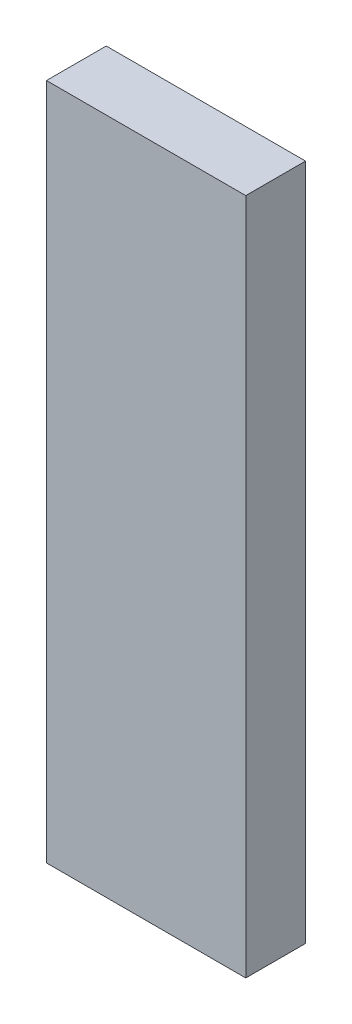
ISO-10303-21;
HEADER;
FILE_DESCRIPTION(('STEP AP214'),'2;1');
FILE_NAME('part.step','',(''),(''),'','','');
FILE_SCHEMA(('AUTOMOTIVE_DESIGN { 1 0 10303 214 1 1 1 1 }'));
ENDSEC;
DATA;
#1=APPLICATION_CONTEXT('core data for automotive mechanical design processes');
#2=APPLICATION_PROTOCOL_DEFINITION('international standard','automotive_design',2000,#1);
#3=PRODUCT_CONTEXT('',#1,'mechanical');
#4=PRODUCT('Part','Part','',(#3));
#5=PRODUCT_RELATED_PRODUCT_CATEGORY('part','',(#4));
#6=PRODUCT_DEFINITION_FORMATION('','',#4);
#7=PRODUCT_DEFINITION_CONTEXT('part definition',#1,'design');
#8=PRODUCT_DEFINITION('design','',#6,#7);
#9=PRODUCT_DEFINITION_SHAPE('','',#8);
#10=(LENGTH_UNIT() NAMED_UNIT(*) SI_UNIT(.MILLI.,.METRE.));
#11=(NAMED_UNIT(*) PLANE_ANGLE_UNIT() SI_UNIT($,.RADIAN.));
#12=(NAMED_UNIT(*) SI_UNIT($,.STERADIAN.) SOLID_ANGLE_UNIT());
#13=UNCERTAINTY_MEASURE_WITH_UNIT(LENGTH_MEASURE(1.E-05),#10,'distance_accuracy_value','');
#14=(GEOMETRIC_REPRESENTATION_CONTEXT(3) GLOBAL_UNCERTAINTY_ASSIGNED_CONTEXT((#13)) GLOBAL_UNIT_ASSIGNED_CONTEXT((#10,
#11,#12)) REPRESENTATION_CONTEXT('',''));
#15=CARTESIAN_POINT('',(0.,0.,0.));
#16=DIRECTION('',(0.,0.,1.));
#17=DIRECTION('',(1.,0.,0.));
#18=AXIS2_PLACEMENT_3D('',#15,#16,#17);
#19=CARTESIAN_POINT('',(25.,170.,7.5));
#20=DIRECTION('',(-1.,0.,0.));
#21=DIRECTION('',(0.,0.,1.));
#22=AXIS2_PLACEMENT_3D('',#19,#20,#21);
#23=PLANE('',#22);
#24=DIRECTION('',(0.,0.,-1.));
#25=VECTOR('',#24,1.);
#26=CARTESIAN_POINT('',(25.,0.,7.5));
#27=LINE('',#26,#25);
#28=CARTESIAN_POINT('',(25.,0.,7.5));
#29=VERTEX_POINT('',#28);
#30=CARTESIAN_POINT('',(25.,0.,-7.5));
#31=VERTEX_POINT('',#30);
#32=EDGE_CURVE('E107',#29,#31,#27,.T.);
#33=ORIENTED_EDGE('',*,*,#32,.T.);
#34=DIRECTION('',(0.,-1.,0.));
#35=VECTOR('',#34,1.);
#36=CARTESIAN_POINT('',(25.,170.,-7.5));
#37=LINE('',#36,#35);
#38=CARTESIAN_POINT('',(25.,170.,-7.5));
#39=VERTEX_POINT('',#38);
#40=EDGE_CURVE('E11',#39,#31,#37,.T.);
#41=ORIENTED_EDGE('',*,*,#40,.F.);
#42=DIRECTION('',(0.,0.,-1.));
#43=VECTOR('',#42,1.);
#44=CARTESIAN_POINT('',(25.,170.,7.5));
#45=LINE('',#44,#43);
#46=CARTESIAN_POINT('',(25.,170.,7.5));
#47=VERTEX_POINT('',#46);
#48=EDGE_CURVE('E91',#47,#39,#45,.T.);
#49=ORIENTED_EDGE('',*,*,#48,.F.);
#50=DIRECTION('',(0.,-1.,0.));
#51=VECTOR('',#50,1.);
#52=CARTESIAN_POINT('',(25.,170.,7.5));
#53=LINE('',#52,#51);
#54=EDGE_CURVE('E103',#47,#29,#53,.T.);
#55=ORIENTED_EDGE('',*,*,#54,.T.);
#56=EDGE_LOOP('',(#33,#41,#49,#55));
#57=FACE_BOUND('',#56,.T.);
#58=ADVANCED_FACE('F39',(#57),#23,.F.);
#59=CARTESIAN_POINT('',(-25.,170.,-7.5));
#60=DIRECTION('',(0.,0.,1.));
#61=DIRECTION('',(1.,0.,0.));
#62=AXIS2_PLACEMENT_3D('',#59,#60,#61);
#63=PLANE('',#62);
#64=DIRECTION('',(-1.,0.,0.));
#65=VECTOR('',#64,1.);
#66=CARTESIAN_POINT('',(-25.,0.,-7.5));
#67=LINE('',#66,#65);
#68=CARTESIAN_POINT('',(-25.,0.,-7.5));
#69=VERTEX_POINT('',#68);
#70=EDGE_CURVE('E96',#31,#69,#67,.T.);
#71=ORIENTED_EDGE('',*,*,#70,.T.);
#72=DIRECTION('',(0.,-1.,0.));
#73=VECTOR('',#72,1.);
#74=CARTESIAN_POINT('',(-25.,170.,-7.5));
#75=LINE('',#74,#73);
#76=CARTESIAN_POINT('',(-25.,170.,-7.5));
#77=VERTEX_POINT('',#76);
#78=EDGE_CURVE('E48',#77,#69,#75,.T.);
#79=ORIENTED_EDGE('',*,*,#78,.F.);
#80=DIRECTION('',(-1.,0.,0.));
#81=VECTOR('',#80,1.);
#82=CARTESIAN_POINT('',(-25.,170.,-7.5));
#83=LINE('',#82,#81);
#84=EDGE_CURVE('E86',#39,#77,#83,.T.);
#85=ORIENTED_EDGE('',*,*,#84,.F.);
#86=ORIENTED_EDGE('',*,*,#40,.T.);
#87=EDGE_LOOP('',(#71,#79,#85,#86));
#88=FACE_BOUND('',#87,.T.);
#89=ADVANCED_FACE('F95',(#88),#63,.F.);
#90=CARTESIAN_POINT('',(-25.,170.,7.5));
#91=DIRECTION('',(1.,0.,0.));
#92=DIRECTION('',(0.,0.,-1.));
#93=AXIS2_PLACEMENT_3D('',#90,#91,#92);
#94=PLANE('',#93);
#95=DIRECTION('',(0.,0.,1.));
#96=VECTOR('',#95,1.);
#97=CARTESIAN_POINT('',(-25.,0.,7.5));
#98=LINE('',#97,#96);
#99=CARTESIAN_POINT('',(-25.,0.,7.5));
#100=VERTEX_POINT('',#99);
#101=EDGE_CURVE('E73',#69,#100,#98,.T.);
#102=ORIENTED_EDGE('',*,*,#101,.T.);
#103=DIRECTION('',(0.,-1.,0.));
#104=VECTOR('',#103,1.);
#105=CARTESIAN_POINT('',(-25.,170.,7.5));
#106=LINE('',#105,#104);
#107=CARTESIAN_POINT('',(-25.,170.,7.5));
#108=VERTEX_POINT('',#107);
#109=EDGE_CURVE('E98',#108,#100,#106,.T.);
#110=ORIENTED_EDGE('',*,*,#109,.F.);
#111=DIRECTION('',(0.,0.,1.));
#112=VECTOR('',#111,1.);
#113=CARTESIAN_POINT('',(-25.,170.,7.5));
#114=LINE('',#113,#112);
#115=EDGE_CURVE('E89',#77,#108,#114,.T.);
#116=ORIENTED_EDGE('',*,*,#115,.F.);
#117=ORIENTED_EDGE('',*,*,#78,.T.);
#118=EDGE_LOOP('',(#102,#110,#116,#117));
#119=FACE_BOUND('',#118,.T.);
#120=ADVANCED_FACE('F99',(#119),#94,.F.);
#121=CARTESIAN_POINT('',(-25.,170.,7.5));
#122=DIRECTION('',(0.,0.,-1.));
#123=DIRECTION('',(-1.,0.,0.));
#124=AXIS2_PLACEMENT_3D('',#121,#122,#123);
#125=PLANE('',#124);
#126=DIRECTION('',(1.,0.,0.));
#127=VECTOR('',#126,1.);
#128=CARTESIAN_POINT('',(-25.,0.,7.5));
#129=LINE('',#128,#127);
#130=EDGE_CURVE('E79',#100,#29,#129,.T.);
#131=ORIENTED_EDGE('',*,*,#130,.T.);
#132=ORIENTED_EDGE('',*,*,#54,.F.);
#133=DIRECTION('',(1.,0.,0.));
#134=VECTOR('',#133,1.);
#135=CARTESIAN_POINT('',(-25.,170.,7.5));
#136=LINE('',#135,#134);
#137=EDGE_CURVE('E56',#108,#47,#136,.T.);
#138=ORIENTED_EDGE('',*,*,#137,.F.);
#139=ORIENTED_EDGE('',*,*,#109,.T.);
#140=EDGE_LOOP('',(#131,#132,#138,#139));
#141=FACE_BOUND('',#140,.T.);
#142=ADVANCED_FACE('F120',(#141),#125,.F.);
#143=CARTESIAN_POINT('',(0.,170.,0.));
#144=DIRECTION('',(0.,-1.,0.));
#145=DIRECTION('',(0.,0.,-1.));
#146=AXIS2_PLACEMENT_3D('',#143,#144,#145);
#147=PLANE('',#146);
#148=ORIENTED_EDGE('',*,*,#48,.T.);
#149=ORIENTED_EDGE('',*,*,#84,.T.);
#150=ORIENTED_EDGE('',*,*,#115,.T.);
#151=ORIENTED_EDGE('',*,*,#137,.T.);
#152=EDGE_LOOP('',(#148,#149,#150,#151));
#153=FACE_BOUND('',#152,.T.);
#154=ADVANCED_FACE('F87',(#153),#147,.F.);
#155=CARTESIAN_POINT('',(0.,0.,0.));
#156=DIRECTION('',(0.,-1.,0.));
#157=DIRECTION('',(0.,0.,-1.));
#158=AXIS2_PLACEMENT_3D('',#155,#156,#157);
#159=PLANE('',#158);
#160=ORIENTED_EDGE('',*,*,#32,.F.);
#161=ORIENTED_EDGE('',*,*,#130,.F.);
#162=ORIENTED_EDGE('',*,*,#101,.F.);
#163=ORIENTED_EDGE('',*,*,#70,.F.);
#164=EDGE_LOOP('',(#160,#161,#162,#163));
#165=FACE_BOUND('',#164,.T.);
#166=ADVANCED_FACE('F123',(#165),#159,.T.);
#167=CLOSED_SHELL('',(#58,#89,#120,#142,#154,#166));
#168=MANIFOLD_SOLID_BREP('B2',#167);
#169=ADVANCED_BREP_SHAPE_REPRESENTATION('',(#18,#168),#14);
#170=SHAPE_DEFINITION_REPRESENTATION(#9,#169);
ENDSEC;
END-ISO-10303-21;
